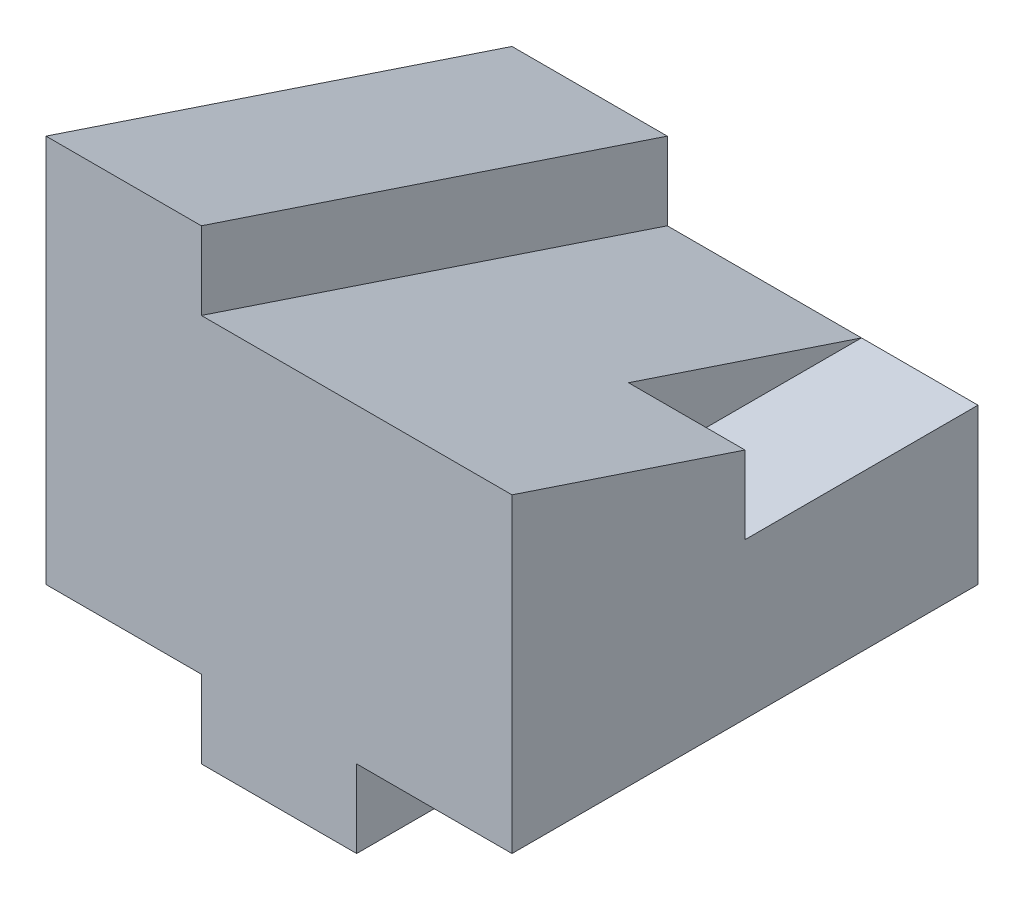
ISO-10303-21;
HEADER;
FILE_DESCRIPTION(('STEP AP214'),'2;1');
FILE_NAME('part.step','',(''),(''),'','','');
FILE_SCHEMA(('AUTOMOTIVE_DESIGN { 1 0 10303 214 1 1 1 1 }'));
ENDSEC;
DATA;
#1=APPLICATION_CONTEXT('core data for automotive mechanical design processes');
#2=APPLICATION_PROTOCOL_DEFINITION('international standard','automotive_design',2000,#1);
#3=PRODUCT_CONTEXT('',#1,'mechanical');
#4=PRODUCT('Part','Part','',(#3));
#5=PRODUCT_RELATED_PRODUCT_CATEGORY('part','',(#4));
#6=PRODUCT_DEFINITION_FORMATION('','',#4);
#7=PRODUCT_DEFINITION_CONTEXT('part definition',#1,'design');
#8=PRODUCT_DEFINITION('design','',#6,#7);
#9=PRODUCT_DEFINITION_SHAPE('','',#8);
#10=(LENGTH_UNIT() NAMED_UNIT(*) SI_UNIT(.MILLI.,.METRE.));
#11=(NAMED_UNIT(*) PLANE_ANGLE_UNIT() SI_UNIT($,.RADIAN.));
#12=(NAMED_UNIT(*) SI_UNIT($,.STERADIAN.) SOLID_ANGLE_UNIT());
#13=UNCERTAINTY_MEASURE_WITH_UNIT(LENGTH_MEASURE(1.E-05),#10,'distance_accuracy_value','');
#14=(GEOMETRIC_REPRESENTATION_CONTEXT(3) GLOBAL_UNCERTAINTY_ASSIGNED_CONTEXT((#13)) GLOBAL_UNIT_ASSIGNED_CONTEXT((#10,
#11,#12)) REPRESENTATION_CONTEXT('',''));
#15=CARTESIAN_POINT('',(0.,0.,0.));
#16=DIRECTION('',(0.,0.,1.));
#17=DIRECTION('',(1.,0.,0.));
#18=AXIS2_PLACEMENT_3D('',#15,#16,#17);
#19=CARTESIAN_POINT('',(25.,36.,-12.));
#20=DIRECTION('',(0.,-0.948683298050514,0.316227766016838));
#21=DIRECTION('',(0.,-0.316227766016838,-0.948683298050514));
#22=AXIS2_PLACEMENT_3D('',#19,#20,#21);
#23=PLANE('',#22);
#24=DIRECTION('',(0.,0.316227766016838,0.948683298050514));
#25=VECTOR('',#24,1.);
#26=CARTESIAN_POINT('',(0.,36.,-12.));
#27=LINE('',#26,#25);
#28=CARTESIAN_POINT('',(0.,20.,-60.));
#29=VERTEX_POINT('',#28);
#30=CARTESIAN_POINT('',(0.,40.,0.));
#31=VERTEX_POINT('',#30);
#32=EDGE_CURVE('E216',#29,#31,#27,.T.);
#33=ORIENTED_EDGE('',*,*,#32,.T.);
#34=DIRECTION('',(-1.,0.,0.));
#35=VECTOR('',#34,1.);
#36=CARTESIAN_POINT('',(40.,40.,0.));
#37=LINE('',#36,#35);
#38=CARTESIAN_POINT('',(40.,40.,0.));
#39=VERTEX_POINT('',#38);
#40=EDGE_CURVE('E207',#39,#31,#37,.T.);
#41=ORIENTED_EDGE('',*,*,#40,.F.);
#42=DIRECTION('',(0.,0.316227766016838,0.948683298050514));
#43=VECTOR('',#42,1.);
#44=CARTESIAN_POINT('',(40.,36.,-12.));
#45=LINE('',#44,#43);
#46=CARTESIAN_POINT('',(40.,30.,-30.));
#47=VERTEX_POINT('',#46);
#48=EDGE_CURVE('E188',#47,#39,#45,.T.);
#49=ORIENTED_EDGE('',*,*,#48,.F.);
#50=DIRECTION('',(-1.,0.,0.));
#51=VECTOR('',#50,1.);
#52=CARTESIAN_POINT('',(40.,30.,-30.));
#53=LINE('',#52,#51);
#54=CARTESIAN_POINT('',(25.,30.,-30.));
#55=VERTEX_POINT('',#54);
#56=EDGE_CURVE('E210',#47,#55,#53,.T.);
#57=ORIENTED_EDGE('',*,*,#56,.T.);
#58=DIRECTION('',(0.,0.316227766016838,0.948683298050514));
#59=VECTOR('',#58,1.);
#60=CARTESIAN_POINT('',(25.,36.,-12.));
#61=LINE('',#60,#59);
#62=CARTESIAN_POINT('',(25.,20.,-60.));
#63=VERTEX_POINT('',#62);
#64=EDGE_CURVE('E42',#63,#55,#61,.T.);
#65=ORIENTED_EDGE('',*,*,#64,.F.);
#66=DIRECTION('',(-1.,0.,0.));
#67=VECTOR('',#66,1.);
#68=CARTESIAN_POINT('',(25.,20.,-60.));
#69=LINE('',#68,#67);
#70=EDGE_CURVE('E11',#63,#29,#69,.T.);
#71=ORIENTED_EDGE('',*,*,#70,.T.);
#72=EDGE_LOOP('',(#33,#41,#49,#57,#65,#71));
#73=FACE_BOUND('',#72,.T.);
#74=ADVANCED_FACE('F35',(#73),#23,.F.);
#75=CARTESIAN_POINT('',(25.,0.,0.));
#76=DIRECTION('',(1.,0.,0.));
#77=DIRECTION('',(0.,0.,-1.));
#78=AXIS2_PLACEMENT_3D('',#75,#76,#77);
#79=PLANE('',#78);
#80=DIRECTION('',(0.,-1.,0.));
#81=VECTOR('',#80,1.);
#82=CARTESIAN_POINT('',(25.,0.,-30.));
#83=LINE('',#82,#81);
#84=CARTESIAN_POINT('',(25.,20.,-30.));
#85=VERTEX_POINT('',#84);
#86=EDGE_CURVE('E217',#55,#85,#83,.T.);
#87=ORIENTED_EDGE('',*,*,#86,.T.);
#88=DIRECTION('',(0.,0.,-1.));
#89=VECTOR('',#88,1.);
#90=CARTESIAN_POINT('',(25.,20.,0.));
#91=LINE('',#90,#89);
#92=EDGE_CURVE('E219',#85,#63,#91,.T.);
#93=ORIENTED_EDGE('',*,*,#92,.T.);
#94=ORIENTED_EDGE('',*,*,#64,.T.);
#95=EDGE_LOOP('',(#87,#93,#94));
#96=FACE_BOUND('',#95,.T.);
#97=ADVANCED_FACE('F245',(#96),#79,.T.);
#98=CARTESIAN_POINT('',(0.,0.,0.));
#99=DIRECTION('',(1.,0.,0.));
#100=DIRECTION('',(0.,0.,-1.));
#101=AXIS2_PLACEMENT_3D('',#98,#99,#100);
#102=PLANE('',#101);
#103=DIRECTION('',(0.,-1.,0.));
#104=VECTOR('',#103,1.);
#105=CARTESIAN_POINT('',(0.,0.,0.));
#106=LINE('',#105,#104);
#107=CARTESIAN_POINT('',(0.,0.,0.));
#108=VERTEX_POINT('',#107);
#109=CARTESIAN_POINT('',(0.,-10.,0.));
#110=VERTEX_POINT('',#109);
#111=EDGE_CURVE('E181',#108,#110,#106,.T.);
#112=ORIENTED_EDGE('',*,*,#111,.F.);
#113=DIRECTION('',(0.,0.,-1.));
#114=VECTOR('',#113,1.);
#115=CARTESIAN_POINT('',(0.,0.,0.));
#116=LINE('',#115,#114);
#117=CARTESIAN_POINT('',(0.,0.,-60.));
#118=VERTEX_POINT('',#117);
#119=EDGE_CURVE('E156',#108,#118,#116,.T.);
#120=ORIENTED_EDGE('',*,*,#119,.T.);
#121=DIRECTION('',(0.,1.,0.));
#122=VECTOR('',#121,1.);
#123=CARTESIAN_POINT('',(0.,0.,-60.));
#124=LINE('',#123,#122);
#125=CARTESIAN_POINT('',(0.,-10.,-60.));
#126=VERTEX_POINT('',#125);
#127=EDGE_CURVE('E143',#126,#118,#124,.T.);
#128=ORIENTED_EDGE('',*,*,#127,.F.);
#129=DIRECTION('',(0.,0.,-1.));
#130=VECTOR('',#129,1.);
#131=CARTESIAN_POINT('',(0.,-10.,0.));
#132=LINE('',#131,#130);
#133=EDGE_CURVE('E163',#110,#126,#132,.T.);
#134=ORIENTED_EDGE('',*,*,#133,.F.);
#135=EDGE_LOOP('',(#112,#120,#128,#134));
#136=FACE_BOUND('',#135,.T.);
#137=ADVANCED_FACE('F258',(#136),#102,.F.);
#138=CARTESIAN_POINT('',(40.,20.,0.));
#139=DIRECTION('',(0.,1.,0.));
#140=DIRECTION('',(0.,0.,1.));
#141=AXIS2_PLACEMENT_3D('',#138,#139,#140);
#142=PLANE('',#141);
#143=DIRECTION('',(-1.,0.,0.));
#144=VECTOR('',#143,1.);
#145=CARTESIAN_POINT('',(40.,20.,-60.));
#146=LINE('',#145,#144);
#147=CARTESIAN_POINT('',(40.,20.,-60.));
#148=VERTEX_POINT('',#147);
#149=EDGE_CURVE('E196',#148,#63,#146,.T.);
#150=ORIENTED_EDGE('',*,*,#149,.T.);
#151=ORIENTED_EDGE('',*,*,#92,.F.);
#152=DIRECTION('',(-1.,0.,0.));
#153=VECTOR('',#152,1.);
#154=CARTESIAN_POINT('',(40.,20.,-30.));
#155=LINE('',#154,#153);
#156=CARTESIAN_POINT('',(40.,20.,-30.));
#157=VERTEX_POINT('',#156);
#158=EDGE_CURVE('E213',#157,#85,#155,.T.);
#159=ORIENTED_EDGE('',*,*,#158,.F.);
#160=DIRECTION('',(0.,0.,-1.));
#161=VECTOR('',#160,1.);
#162=CARTESIAN_POINT('',(40.,20.,0.));
#163=LINE('',#162,#161);
#164=EDGE_CURVE('E182',#157,#148,#163,.T.);
#165=ORIENTED_EDGE('',*,*,#164,.T.);
#166=EDGE_LOOP('',(#150,#151,#159,#165));
#167=FACE_BOUND('',#166,.T.);
#168=ADVANCED_FACE('F247',(#167),#142,.T.);
#169=CARTESIAN_POINT('',(40.,0.,-30.));
#170=DIRECTION('',(0.,0.,-1.));
#171=DIRECTION('',(0.,1.,0.));
#172=AXIS2_PLACEMENT_3D('',#169,#170,#171);
#173=PLANE('',#172);
#174=ORIENTED_EDGE('',*,*,#158,.T.);
#175=ORIENTED_EDGE('',*,*,#86,.F.);
#176=ORIENTED_EDGE('',*,*,#56,.F.);
#177=DIRECTION('',(0.,-1.,0.));
#178=VECTOR('',#177,1.);
#179=CARTESIAN_POINT('',(40.,0.,-30.));
#180=LINE('',#179,#178);
#181=EDGE_CURVE('E185',#47,#157,#180,.T.);
#182=ORIENTED_EDGE('',*,*,#181,.T.);
#183=EDGE_LOOP('',(#174,#175,#176,#182));
#184=FACE_BOUND('',#183,.T.);
#185=ADVANCED_FACE('F242',(#184),#173,.T.);
#186=CARTESIAN_POINT('',(40.,0.,0.));
#187=DIRECTION('',(0.,0.,-1.));
#188=DIRECTION('',(0.,1.,0.));
#189=AXIS2_PLACEMENT_3D('',#186,#187,#188);
#190=PLANE('',#189);
#191=ORIENTED_EDGE('',*,*,#40,.T.);
#192=DIRECTION('',(0.,-1.,0.));
#193=VECTOR('',#192,1.);
#194=CARTESIAN_POINT('',(0.,0.,0.));
#195=LINE('',#194,#193);
#196=CARTESIAN_POINT('',(0.,50.,0.));
#197=VERTEX_POINT('',#196);
#198=EDGE_CURVE('E149',#197,#31,#195,.T.);
#199=ORIENTED_EDGE('',*,*,#198,.F.);
#200=DIRECTION('',(1.,0.,0.));
#201=VECTOR('',#200,1.);
#202=CARTESIAN_POINT('',(-20.,50.,0.));
#203=LINE('',#202,#201);
#204=CARTESIAN_POINT('',(-20.,50.,0.));
#205=VERTEX_POINT('',#204);
#206=EDGE_CURVE('E164',#205,#197,#203,.T.);
#207=ORIENTED_EDGE('',*,*,#206,.F.);
#208=DIRECTION('',(0.,-1.,0.));
#209=VECTOR('',#208,1.);
#210=CARTESIAN_POINT('',(-20.,0.,0.));
#211=LINE('',#210,#209);
#212=CARTESIAN_POINT('',(-20.,0.,0.));
#213=VERTEX_POINT('',#212);
#214=EDGE_CURVE('E145',#205,#213,#211,.T.);
#215=ORIENTED_EDGE('',*,*,#214,.T.);
#216=DIRECTION('',(1.,0.,0.));
#217=VECTOR('',#216,1.);
#218=CARTESIAN_POINT('',(-20.,0.,0.));
#219=LINE('',#218,#217);
#220=EDGE_CURVE('E148',#213,#108,#219,.T.);
#221=ORIENTED_EDGE('',*,*,#220,.T.);
#222=ORIENTED_EDGE('',*,*,#111,.T.);
#223=DIRECTION('',(-1.,0.,0.));
#224=VECTOR('',#223,1.);
#225=CARTESIAN_POINT('',(20.,-10.,0.));
#226=LINE('',#225,#224);
#227=CARTESIAN_POINT('',(20.,-10.,0.));
#228=VERTEX_POINT('',#227);
#229=EDGE_CURVE('E174',#228,#110,#226,.T.);
#230=ORIENTED_EDGE('',*,*,#229,.F.);
#231=DIRECTION('',(0.,-1.,0.));
#232=VECTOR('',#231,1.);
#233=CARTESIAN_POINT('',(20.,0.,0.));
#234=LINE('',#233,#232);
#235=CARTESIAN_POINT('',(20.,0.,0.));
#236=VERTEX_POINT('',#235);
#237=EDGE_CURVE('E172',#236,#228,#234,.T.);
#238=ORIENTED_EDGE('',*,*,#237,.F.);
#239=DIRECTION('',(-1.,0.,0.));
#240=VECTOR('',#239,1.);
#241=CARTESIAN_POINT('',(40.,0.,0.));
#242=LINE('',#241,#240);
#243=CARTESIAN_POINT('',(40.,0.,0.));
#244=VERTEX_POINT('',#243);
#245=EDGE_CURVE('E204',#244,#236,#242,.T.);
#246=ORIENTED_EDGE('',*,*,#245,.F.);
#247=DIRECTION('',(0.,-1.,0.));
#248=VECTOR('',#247,1.);
#249=CARTESIAN_POINT('',(40.,0.,0.));
#250=LINE('',#249,#248);
#251=EDGE_CURVE('E190',#39,#244,#250,.T.);
#252=ORIENTED_EDGE('',*,*,#251,.F.);
#253=EDGE_LOOP('',(#191,#199,#207,#215,#221,#222,#230,#238,#246,#252));
#254=FACE_BOUND('',#253,.T.);
#255=ADVANCED_FACE('F232',(#254),#190,.F.);
#256=CARTESIAN_POINT('',(40.,0.,0.));
#257=DIRECTION('',(0.,1.,0.));
#258=DIRECTION('',(0.,0.,1.));
#259=AXIS2_PLACEMENT_3D('',#256,#257,#258);
#260=PLANE('',#259);
#261=ORIENTED_EDGE('',*,*,#245,.T.);
#262=DIRECTION('',(0.,0.,-1.));
#263=VECTOR('',#262,1.);
#264=CARTESIAN_POINT('',(20.,0.,0.));
#265=LINE('',#264,#263);
#266=CARTESIAN_POINT('',(20.,0.,-60.));
#267=VERTEX_POINT('',#266);
#268=EDGE_CURVE('E170',#236,#267,#265,.T.);
#269=ORIENTED_EDGE('',*,*,#268,.T.);
#270=DIRECTION('',(-1.,0.,0.));
#271=VECTOR('',#270,1.);
#272=CARTESIAN_POINT('',(40.,0.,-60.));
#273=LINE('',#272,#271);
#274=CARTESIAN_POINT('',(40.,0.,-60.));
#275=VERTEX_POINT('',#274);
#276=EDGE_CURVE('E201',#275,#267,#273,.T.);
#277=ORIENTED_EDGE('',*,*,#276,.F.);
#278=DIRECTION('',(0.,0.,-1.));
#279=VECTOR('',#278,1.);
#280=CARTESIAN_POINT('',(40.,0.,0.));
#281=LINE('',#280,#279);
#282=EDGE_CURVE('E192',#244,#275,#281,.T.);
#283=ORIENTED_EDGE('',*,*,#282,.F.);
#284=EDGE_LOOP('',(#261,#269,#277,#283));
#285=FACE_BOUND('',#284,.T.);
#286=ADVANCED_FACE('F265',(#285),#260,.F.);
#287=CARTESIAN_POINT('',(40.,0.,-60.));
#288=DIRECTION('',(0.,0.,1.));
#289=DIRECTION('',(1.,0.,0.));
#290=AXIS2_PLACEMENT_3D('',#287,#288,#289);
#291=PLANE('',#290);
#292=ORIENTED_EDGE('',*,*,#127,.T.);
#293=DIRECTION('',(1.,0.,0.));
#294=VECTOR('',#293,1.);
#295=CARTESIAN_POINT('',(-20.,0.,-60.));
#296=LINE('',#295,#294);
#297=CARTESIAN_POINT('',(-20.,0.,-60.));
#298=VERTEX_POINT('',#297);
#299=EDGE_CURVE('E49',#298,#118,#296,.T.);
#300=ORIENTED_EDGE('',*,*,#299,.F.);
#301=DIRECTION('',(0.,-1.,0.));
#302=VECTOR('',#301,1.);
#303=CARTESIAN_POINT('',(-20.,0.,-60.));
#304=LINE('',#303,#302);
#305=CARTESIAN_POINT('',(-20.,30.,-60.));
#306=VERTEX_POINT('',#305);
#307=EDGE_CURVE('E129',#306,#298,#304,.T.);
#308=ORIENTED_EDGE('',*,*,#307,.F.);
#309=DIRECTION('',(1.,0.,0.));
#310=VECTOR('',#309,1.);
#311=CARTESIAN_POINT('',(-20.,30.,-60.));
#312=LINE('',#311,#310);
#313=CARTESIAN_POINT('',(0.,30.,-60.));
#314=VERTEX_POINT('',#313);
#315=EDGE_CURVE('E144',#306,#314,#312,.T.);
#316=ORIENTED_EDGE('',*,*,#315,.T.);
#317=DIRECTION('',(0.,-1.,0.));
#318=VECTOR('',#317,1.);
#319=CARTESIAN_POINT('',(0.,0.,-60.));
#320=LINE('',#319,#318);
#321=EDGE_CURVE('E158',#314,#29,#320,.T.);
#322=ORIENTED_EDGE('',*,*,#321,.T.);
#323=ORIENTED_EDGE('',*,*,#70,.F.);
#324=ORIENTED_EDGE('',*,*,#149,.F.);
#325=DIRECTION('',(0.,1.,0.));
#326=VECTOR('',#325,1.);
#327=CARTESIAN_POINT('',(40.,0.,-60.));
#328=LINE('',#327,#326);
#329=EDGE_CURVE('E194',#275,#148,#328,.T.);
#330=ORIENTED_EDGE('',*,*,#329,.F.);
#331=ORIENTED_EDGE('',*,*,#276,.T.);
#332=DIRECTION('',(0.,1.,0.));
#333=VECTOR('',#332,1.);
#334=CARTESIAN_POINT('',(20.,0.,-60.));
#335=LINE('',#334,#333);
#336=CARTESIAN_POINT('',(20.,-10.,-60.));
#337=VERTEX_POINT('',#336);
#338=EDGE_CURVE('E57',#337,#267,#335,.T.);
#339=ORIENTED_EDGE('',*,*,#338,.F.);
#340=DIRECTION('',(-1.,0.,0.));
#341=VECTOR('',#340,1.);
#342=CARTESIAN_POINT('',(20.,-10.,-60.));
#343=LINE('',#342,#341);
#344=EDGE_CURVE('E179',#337,#126,#343,.T.);
#345=ORIENTED_EDGE('',*,*,#344,.T.);
#346=EDGE_LOOP('',(#292,#300,#308,#316,#322,#323,#324,#330,#331,#339,#345));
#347=FACE_BOUND('',#346,.T.);
#348=ADVANCED_FACE('F141',(#347),#291,.F.);
#349=CARTESIAN_POINT('',(40.,0.,0.));
#350=DIRECTION('',(1.,0.,0.));
#351=DIRECTION('',(0.,0.,-1.));
#352=AXIS2_PLACEMENT_3D('',#349,#350,#351);
#353=PLANE('',#352);
#354=ORIENTED_EDGE('',*,*,#164,.F.);
#355=ORIENTED_EDGE('',*,*,#181,.F.);
#356=ORIENTED_EDGE('',*,*,#48,.T.);
#357=ORIENTED_EDGE('',*,*,#251,.T.);
#358=ORIENTED_EDGE('',*,*,#282,.T.);
#359=ORIENTED_EDGE('',*,*,#329,.T.);
#360=EDGE_LOOP('',(#354,#355,#356,#357,#358,#359));
#361=FACE_BOUND('',#360,.T.);
#362=ADVANCED_FACE('F237',(#361),#353,.T.);
#363=CARTESIAN_POINT('',(20.,-10.,0.));
#364=DIRECTION('',(0.,1.,0.));
#365=DIRECTION('',(0.,0.,1.));
#366=AXIS2_PLACEMENT_3D('',#363,#364,#365);
#367=PLANE('',#366);
#368=ORIENTED_EDGE('',*,*,#133,.T.);
#369=ORIENTED_EDGE('',*,*,#344,.F.);
#370=DIRECTION('',(0.,0.,-1.));
#371=VECTOR('',#370,1.);
#372=CARTESIAN_POINT('',(20.,-10.,0.));
#373=LINE('',#372,#371);
#374=EDGE_CURVE('E167',#228,#337,#373,.T.);
#375=ORIENTED_EDGE('',*,*,#374,.F.);
#376=ORIENTED_EDGE('',*,*,#229,.T.);
#377=EDGE_LOOP('',(#368,#369,#375,#376));
#378=FACE_BOUND('',#377,.T.);
#379=ADVANCED_FACE('F261',(#378),#367,.F.);
#380=CARTESIAN_POINT('',(20.,0.,0.));
#381=DIRECTION('',(1.,0.,0.));
#382=DIRECTION('',(0.,0.,-1.));
#383=AXIS2_PLACEMENT_3D('',#380,#381,#382);
#384=PLANE('',#383);
#385=ORIENTED_EDGE('',*,*,#374,.T.);
#386=ORIENTED_EDGE('',*,*,#338,.T.);
#387=ORIENTED_EDGE('',*,*,#268,.F.);
#388=ORIENTED_EDGE('',*,*,#237,.T.);
#389=EDGE_LOOP('',(#385,#386,#387,#388));
#390=FACE_BOUND('',#389,.T.);
#391=ADVANCED_FACE('F263',(#390),#384,.T.);
#392=CARTESIAN_POINT('',(0.,0.,0.));
#393=DIRECTION('',(1.,0.,0.));
#394=DIRECTION('',(0.,0.,-1.));
#395=AXIS2_PLACEMENT_3D('',#392,#393,#394);
#396=PLANE('',#395);
#397=ORIENTED_EDGE('',*,*,#32,.F.);
#398=ORIENTED_EDGE('',*,*,#321,.F.);
#399=DIRECTION('',(0.,-0.316227766016838,-0.948683298050514));
#400=VECTOR('',#399,1.);
#401=CARTESIAN_POINT('',(0.,45.,-15.));
#402=LINE('',#401,#400);
#403=EDGE_CURVE('E151',#197,#314,#402,.T.);
#404=ORIENTED_EDGE('',*,*,#403,.F.);
#405=ORIENTED_EDGE('',*,*,#198,.T.);
#406=EDGE_LOOP('',(#397,#398,#404,#405));
#407=FACE_BOUND('',#406,.T.);
#408=ADVANCED_FACE('F251',(#407),#396,.T.);
#409=CARTESIAN_POINT('',(-20.,0.,0.));
#410=DIRECTION('',(0.,-1.,0.));
#411=DIRECTION('',(0.,0.,-1.));
#412=AXIS2_PLACEMENT_3D('',#409,#410,#411);
#413=PLANE('',#412);
#414=ORIENTED_EDGE('',*,*,#119,.F.);
#415=ORIENTED_EDGE('',*,*,#220,.F.);
#416=DIRECTION('',(0.,0.,-1.));
#417=VECTOR('',#416,1.);
#418=CARTESIAN_POINT('',(-20.,0.,0.));
#419=LINE('',#418,#417);
#420=EDGE_CURVE('E132',#213,#298,#419,.T.);
#421=ORIENTED_EDGE('',*,*,#420,.T.);
#422=ORIENTED_EDGE('',*,*,#299,.T.);
#423=EDGE_LOOP('',(#414,#415,#421,#422));
#424=FACE_BOUND('',#423,.T.);
#425=ADVANCED_FACE('F147',(#424),#413,.T.);
#426=CARTESIAN_POINT('',(-20.,45.,-15.));
#427=DIRECTION('',(0.,-0.948683298050514,0.316227766016838));
#428=DIRECTION('',(0.,-0.316227766016838,-0.948683298050514));
#429=AXIS2_PLACEMENT_3D('',#426,#427,#428);
#430=PLANE('',#429);
#431=ORIENTED_EDGE('',*,*,#403,.T.);
#432=ORIENTED_EDGE('',*,*,#315,.F.);
#433=DIRECTION('',(0.,-0.316227766016838,-0.948683298050514));
#434=VECTOR('',#433,1.);
#435=CARTESIAN_POINT('',(-20.,45.,-15.));
#436=LINE('',#435,#434);
#437=EDGE_CURVE('E135',#205,#306,#436,.T.);
#438=ORIENTED_EDGE('',*,*,#437,.F.);
#439=ORIENTED_EDGE('',*,*,#206,.T.);
#440=EDGE_LOOP('',(#431,#432,#438,#439));
#441=FACE_BOUND('',#440,.T.);
#442=ADVANCED_FACE('F253',(#441),#430,.F.);
#443=CARTESIAN_POINT('',(-20.,0.,0.));
#444=DIRECTION('',(1.,0.,0.));
#445=DIRECTION('',(0.,0.,-1.));
#446=AXIS2_PLACEMENT_3D('',#443,#444,#445);
#447=PLANE('',#446);
#448=ORIENTED_EDGE('',*,*,#420,.F.);
#449=ORIENTED_EDGE('',*,*,#214,.F.);
#450=ORIENTED_EDGE('',*,*,#437,.T.);
#451=ORIENTED_EDGE('',*,*,#307,.T.);
#452=EDGE_LOOP('',(#448,#449,#450,#451));
#453=FACE_BOUND('',#452,.T.);
#454=ADVANCED_FACE('F130',(#453),#447,.F.);
#455=CLOSED_SHELL('',(#74,#97,#137,#168,#185,#255,#286,#348,#362,#379,#391,#408,#425,#442,#454));
#456=MANIFOLD_SOLID_BREP('B2',#455);
#457=ADVANCED_BREP_SHAPE_REPRESENTATION('',(#18,#456),#14);
#458=SHAPE_DEFINITION_REPRESENTATION(#9,#457);
ENDSEC;
END-ISO-10303-21;
